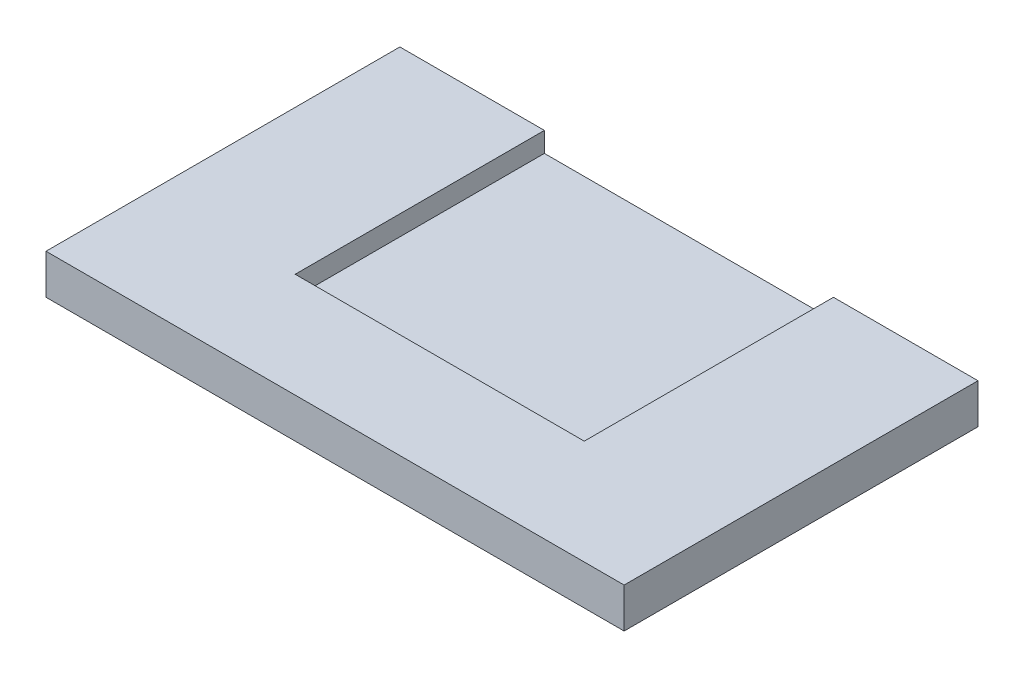
ISO-10303-21;
HEADER;
FILE_DESCRIPTION(('STEP AP214'),'2;1');
FILE_NAME('part.step','',(''),(''),'','','');
FILE_SCHEMA(('AUTOMOTIVE_DESIGN { 1 0 10303 214 1 1 1 1 }'));
ENDSEC;
DATA;
#1=APPLICATION_CONTEXT('core data for automotive mechanical design processes');
#2=APPLICATION_PROTOCOL_DEFINITION('international standard','automotive_design',2000,#1);
#3=PRODUCT_CONTEXT('',#1,'mechanical');
#4=PRODUCT('Part','Part','',(#3));
#5=PRODUCT_RELATED_PRODUCT_CATEGORY('part','',(#4));
#6=PRODUCT_DEFINITION_FORMATION('','',#4);
#7=PRODUCT_DEFINITION_CONTEXT('part definition',#1,'design');
#8=PRODUCT_DEFINITION('design','',#6,#7);
#9=PRODUCT_DEFINITION_SHAPE('','',#8);
#10=(LENGTH_UNIT() NAMED_UNIT(*) SI_UNIT(.MILLI.,.METRE.));
#11=(NAMED_UNIT(*) PLANE_ANGLE_UNIT() SI_UNIT($,.RADIAN.));
#12=(NAMED_UNIT(*) SI_UNIT($,.STERADIAN.) SOLID_ANGLE_UNIT());
#13=UNCERTAINTY_MEASURE_WITH_UNIT(LENGTH_MEASURE(1.E-05),#10,'distance_accuracy_value','');
#14=(GEOMETRIC_REPRESENTATION_CONTEXT(3) GLOBAL_UNCERTAINTY_ASSIGNED_CONTEXT((#13)) GLOBAL_UNIT_ASSIGNED_CONTEXT((#10,
#11,#12)) REPRESENTATION_CONTEXT('',''));
#15=CARTESIAN_POINT('',(0.,0.,0.));
#16=DIRECTION('',(0.,0.,1.));
#17=DIRECTION('',(1.,0.,0.));
#18=AXIS2_PLACEMENT_3D('',#15,#16,#17);
#19=CARTESIAN_POINT('',(-66.6066908635703,4.,36.3519764590724));
#20=DIRECTION('',(0.,0.,1.));
#21=DIRECTION('',(1.,0.,0.));
#22=AXIS2_PLACEMENT_3D('',#19,#20,#21);
#23=PLANE('',#22);
#24=DIRECTION('',(1.,0.,0.));
#25=VECTOR('',#24,1.);
#26=CARTESIAN_POINT('',(0.,2.,36.3519764590724));
#27=LINE('',#26,#25);
#28=CARTESIAN_POINT('',(-66.6066908635703,2.,36.3519764590724));
#29=VERTEX_POINT('',#28);
#30=CARTESIAN_POINT('',(-37.6066908635703,2.,36.3519764590724));
#31=VERTEX_POINT('',#30);
#32=EDGE_CURVE('E45',#29,#31,#27,.T.);
#33=ORIENTED_EDGE('',*,*,#32,.T.);
#34=DIRECTION('',(0.,1.,0.));
#35=VECTOR('',#34,1.);
#36=CARTESIAN_POINT('',(-37.6066908635703,2.,36.3519764590724));
#37=LINE('',#36,#35);
#38=CARTESIAN_POINT('',(-37.6066908635703,4.,36.3519764590724));
#39=VERTEX_POINT('',#38);
#40=EDGE_CURVE('E11',#31,#39,#37,.T.);
#41=ORIENTED_EDGE('',*,*,#40,.T.);
#42=DIRECTION('',(1.,0.,0.));
#43=VECTOR('',#42,1.);
#44=CARTESIAN_POINT('',(0.,4.,36.3519764590724));
#45=LINE('',#44,#43);
#46=CARTESIAN_POINT('',(-23.1066908635703,4.,36.3519764590724));
#47=VERTEX_POINT('',#46);
#48=EDGE_CURVE('E59',#39,#47,#45,.T.);
#49=ORIENTED_EDGE('',*,*,#48,.T.);
#50=DIRECTION('',(0.,-1.,0.));
#51=VECTOR('',#50,1.);
#52=CARTESIAN_POINT('',(-23.1066908635703,0.,36.3519764590724));
#53=LINE('',#52,#51);
#54=CARTESIAN_POINT('',(-23.1066908635703,0.,36.3519764590724));
#55=VERTEX_POINT('',#54);
#56=EDGE_CURVE('E40',#47,#55,#53,.T.);
#57=ORIENTED_EDGE('',*,*,#56,.T.);
#58=DIRECTION('',(1.,0.,0.));
#59=VECTOR('',#58,1.);
#60=CARTESIAN_POINT('',(0.,0.,36.3519764590724));
#61=LINE('',#60,#59);
#62=CARTESIAN_POINT('',(-81.1066908635703,0.,36.3519764590724));
#63=VERTEX_POINT('',#62);
#64=EDGE_CURVE('E137',#63,#55,#61,.T.);
#65=ORIENTED_EDGE('',*,*,#64,.F.);
#66=DIRECTION('',(0.,1.,0.));
#67=VECTOR('',#66,1.);
#68=CARTESIAN_POINT('',(-81.1066908635703,0.,36.3519764590724));
#69=LINE('',#68,#67);
#70=CARTESIAN_POINT('',(-81.1066908635703,4.,36.3519764590724));
#71=VERTEX_POINT('',#70);
#72=EDGE_CURVE('E135',#63,#71,#69,.T.);
#73=ORIENTED_EDGE('',*,*,#72,.T.);
#74=CARTESIAN_POINT('',(-66.6066908635703,4.,36.3519764590724));
#75=VERTEX_POINT('',#74);
#76=EDGE_CURVE('E120',#71,#75,#45,.T.);
#77=ORIENTED_EDGE('',*,*,#76,.T.);
#78=DIRECTION('',(0.,1.,0.));
#79=VECTOR('',#78,1.);
#80=CARTESIAN_POINT('',(-66.6066908635703,2.,36.3519764590724));
#81=LINE('',#80,#79);
#82=EDGE_CURVE('E141',#29,#75,#81,.T.);
#83=ORIENTED_EDGE('',*,*,#82,.F.);
#84=EDGE_LOOP('',(#33,#41,#49,#57,#65,#73,#77,#83));
#85=FACE_BOUND('',#84,.T.);
#86=ADVANCED_FACE('F37',(#85),#23,.F.);
#87=CARTESIAN_POINT('',(0.,4.,0.));
#88=DIRECTION('',(0.,1.,0.));
#89=DIRECTION('',(0.,0.,1.));
#90=AXIS2_PLACEMENT_3D('',#87,#88,#89);
#91=PLANE('',#90);
#92=ORIENTED_EDGE('',*,*,#76,.F.);
#93=DIRECTION('',(0.,0.,-1.));
#94=VECTOR('',#93,1.);
#95=CARTESIAN_POINT('',(-81.1066908635703,4.,71.8519764590724));
#96=LINE('',#95,#94);
#97=CARTESIAN_POINT('',(-81.1066908635703,4.,71.8519764590724));
#98=VERTEX_POINT('',#97);
#99=EDGE_CURVE('E107',#98,#71,#96,.T.);
#100=ORIENTED_EDGE('',*,*,#99,.F.);
#101=DIRECTION('',(1.,0.,0.));
#102=VECTOR('',#101,1.);
#103=CARTESIAN_POINT('',(-127.10669086357,4.,71.8519764590724));
#104=LINE('',#103,#102);
#105=CARTESIAN_POINT('',(-23.1066908635703,4.,71.8519764590724));
#106=VERTEX_POINT('',#105);
#107=EDGE_CURVE('E116',#98,#106,#104,.T.);
#108=ORIENTED_EDGE('',*,*,#107,.T.);
#109=DIRECTION('',(0.,0.,1.));
#110=VECTOR('',#109,1.);
#111=CARTESIAN_POINT('',(-23.1066908635703,4.,-78.1480235409276));
#112=LINE('',#111,#110);
#113=EDGE_CURVE('E128',#47,#106,#112,.T.);
#114=ORIENTED_EDGE('',*,*,#113,.F.);
#115=ORIENTED_EDGE('',*,*,#48,.F.);
#116=DIRECTION('',(0.,0.,-1.));
#117=VECTOR('',#116,1.);
#118=CARTESIAN_POINT('',(-37.6066908635703,4.,0.));
#119=LINE('',#118,#117);
#120=CARTESIAN_POINT('',(-37.6066908635703,4.,61.3519764590724));
#121=VERTEX_POINT('',#120);
#122=EDGE_CURVE('E148',#121,#39,#119,.T.);
#123=ORIENTED_EDGE('',*,*,#122,.F.);
#124=DIRECTION('',(1.,0.,0.));
#125=VECTOR('',#124,1.);
#126=CARTESIAN_POINT('',(0.,4.,61.3519764590724));
#127=LINE('',#126,#125);
#128=CARTESIAN_POINT('',(-66.6066908635703,4.,61.3519764590724));
#129=VERTEX_POINT('',#128);
#130=EDGE_CURVE('E138',#129,#121,#127,.T.);
#131=ORIENTED_EDGE('',*,*,#130,.F.);
#132=DIRECTION('',(0.,0.,-1.));
#133=VECTOR('',#132,1.);
#134=CARTESIAN_POINT('',(-66.6066908635703,4.,0.));
#135=LINE('',#134,#133);
#136=EDGE_CURVE('E146',#129,#75,#135,.T.);
#137=ORIENTED_EDGE('',*,*,#136,.T.);
#138=EDGE_LOOP('',(#92,#100,#108,#114,#115,#123,#131,#137));
#139=FACE_BOUND('',#138,.T.);
#140=ADVANCED_FACE('F115',(#139),#91,.T.);
#141=CARTESIAN_POINT('',(-127.10669086357,4.,71.8519764590724));
#142=DIRECTION('',(0.,0.,-1.));
#143=DIRECTION('',(-1.,0.,0.));
#144=AXIS2_PLACEMENT_3D('',#141,#142,#143);
#145=PLANE('',#144);
#146=DIRECTION('',(0.,1.,0.));
#147=VECTOR('',#146,1.);
#148=CARTESIAN_POINT('',(-81.1066908635703,0.,71.8519764590724));
#149=LINE('',#148,#147);
#150=CARTESIAN_POINT('',(-81.1066908635703,0.,71.8519764590724));
#151=VERTEX_POINT('',#150);
#152=EDGE_CURVE('E104',#151,#98,#149,.T.);
#153=ORIENTED_EDGE('',*,*,#152,.F.);
#154=DIRECTION('',(1.,0.,0.));
#155=VECTOR('',#154,1.);
#156=CARTESIAN_POINT('',(-127.10669086357,0.,71.8519764590724));
#157=LINE('',#156,#155);
#158=CARTESIAN_POINT('',(-23.1066908635703,0.,71.8519764590724));
#159=VERTEX_POINT('',#158);
#160=EDGE_CURVE('E126',#151,#159,#157,.T.);
#161=ORIENTED_EDGE('',*,*,#160,.T.);
#162=DIRECTION('',(0.,-1.,0.));
#163=VECTOR('',#162,1.);
#164=CARTESIAN_POINT('',(-23.1066908635703,4.,71.8519764590724));
#165=LINE('',#164,#163);
#166=EDGE_CURVE('E125',#106,#159,#165,.T.);
#167=ORIENTED_EDGE('',*,*,#166,.F.);
#168=ORIENTED_EDGE('',*,*,#107,.F.);
#169=EDGE_LOOP('',(#153,#161,#167,#168));
#170=FACE_BOUND('',#169,.T.);
#171=ADVANCED_FACE('F123',(#170),#145,.F.);
#172=CARTESIAN_POINT('',(0.,0.,0.));
#173=DIRECTION('',(0.,1.,0.));
#174=DIRECTION('',(0.,0.,1.));
#175=AXIS2_PLACEMENT_3D('',#172,#173,#174);
#176=PLANE('',#175);
#177=DIRECTION('',(0.,0.,1.));
#178=VECTOR('',#177,1.);
#179=CARTESIAN_POINT('',(-81.1066908635703,0.,-78.1480235409276));
#180=LINE('',#179,#178);
#181=EDGE_CURVE('E109',#63,#151,#180,.T.);
#182=ORIENTED_EDGE('',*,*,#181,.F.);
#183=ORIENTED_EDGE('',*,*,#64,.T.);
#184=DIRECTION('',(0.,0.,-1.));
#185=VECTOR('',#184,1.);
#186=CARTESIAN_POINT('',(-23.1066908635703,0.,71.8519764590724));
#187=LINE('',#186,#185);
#188=EDGE_CURVE('E173',#159,#55,#187,.T.);
#189=ORIENTED_EDGE('',*,*,#188,.F.);
#190=ORIENTED_EDGE('',*,*,#160,.F.);
#191=EDGE_LOOP('',(#182,#183,#189,#190));
#192=FACE_BOUND('',#191,.T.);
#193=ADVANCED_FACE('F180',(#192),#176,.F.);
#194=CARTESIAN_POINT('',(-81.1066908635703,0.,0.));
#195=DIRECTION('',(-1.,0.,0.));
#196=DIRECTION('',(0.,0.,1.));
#197=AXIS2_PLACEMENT_3D('',#194,#195,#196);
#198=PLANE('',#197);
#199=ORIENTED_EDGE('',*,*,#72,.F.);
#200=ORIENTED_EDGE('',*,*,#181,.T.);
#201=ORIENTED_EDGE('',*,*,#152,.T.);
#202=ORIENTED_EDGE('',*,*,#99,.T.);
#203=EDGE_LOOP('',(#199,#200,#201,#202));
#204=FACE_BOUND('',#203,.T.);
#205=ADVANCED_FACE('F106',(#204),#198,.T.);
#206=CARTESIAN_POINT('',(-66.6066908635703,2.,0.));
#207=DIRECTION('',(1.,0.,0.));
#208=DIRECTION('',(0.,0.,-1.));
#209=AXIS2_PLACEMENT_3D('',#206,#207,#208);
#210=PLANE('',#209);
#211=ORIENTED_EDGE('',*,*,#136,.F.);
#212=DIRECTION('',(0.,1.,0.));
#213=VECTOR('',#212,1.);
#214=CARTESIAN_POINT('',(-66.6066908635703,2.,61.3519764590724));
#215=LINE('',#214,#213);
#216=CARTESIAN_POINT('',(-66.6066908635703,2.,61.3519764590724));
#217=VERTEX_POINT('',#216);
#218=EDGE_CURVE('E154',#217,#129,#215,.T.);
#219=ORIENTED_EDGE('',*,*,#218,.F.);
#220=DIRECTION('',(0.,0.,-1.));
#221=VECTOR('',#220,1.);
#222=CARTESIAN_POINT('',(-66.6066908635703,2.,0.));
#223=LINE('',#222,#221);
#224=EDGE_CURVE('E158',#217,#29,#223,.T.);
#225=ORIENTED_EDGE('',*,*,#224,.T.);
#226=ORIENTED_EDGE('',*,*,#82,.T.);
#227=EDGE_LOOP('',(#211,#219,#225,#226));
#228=FACE_BOUND('',#227,.T.);
#229=ADVANCED_FACE('F187',(#228),#210,.T.);
#230=CARTESIAN_POINT('',(-37.6066908635703,2.,0.));
#231=DIRECTION('',(1.,0.,0.));
#232=DIRECTION('',(0.,0.,-1.));
#233=AXIS2_PLACEMENT_3D('',#230,#231,#232);
#234=PLANE('',#233);
#235=ORIENTED_EDGE('',*,*,#122,.T.);
#236=ORIENTED_EDGE('',*,*,#40,.F.);
#237=DIRECTION('',(0.,0.,-1.));
#238=VECTOR('',#237,1.);
#239=CARTESIAN_POINT('',(-37.6066908635703,2.,0.));
#240=LINE('',#239,#238);
#241=CARTESIAN_POINT('',(-37.6066908635703,2.,61.3519764590724));
#242=VERTEX_POINT('',#241);
#243=EDGE_CURVE('E152',#242,#31,#240,.T.);
#244=ORIENTED_EDGE('',*,*,#243,.F.);
#245=DIRECTION('',(0.,1.,0.));
#246=VECTOR('',#245,1.);
#247=CARTESIAN_POINT('',(-37.6066908635703,2.,61.3519764590724));
#248=LINE('',#247,#246);
#249=EDGE_CURVE('E161',#242,#121,#248,.T.);
#250=ORIENTED_EDGE('',*,*,#249,.T.);
#251=EDGE_LOOP('',(#235,#236,#244,#250));
#252=FACE_BOUND('',#251,.T.);
#253=ADVANCED_FACE('F168',(#252),#234,.F.);
#254=CARTESIAN_POINT('',(0.,2.,61.3519764590724));
#255=DIRECTION('',(0.,0.,1.));
#256=DIRECTION('',(1.,0.,0.));
#257=AXIS2_PLACEMENT_3D('',#254,#255,#256);
#258=PLANE('',#257);
#259=ORIENTED_EDGE('',*,*,#130,.T.);
#260=ORIENTED_EDGE('',*,*,#249,.F.);
#261=DIRECTION('',(1.,0.,0.));
#262=VECTOR('',#261,1.);
#263=CARTESIAN_POINT('',(0.,2.,61.3519764590724));
#264=LINE('',#263,#262);
#265=EDGE_CURVE('E132',#217,#242,#264,.T.);
#266=ORIENTED_EDGE('',*,*,#265,.F.);
#267=ORIENTED_EDGE('',*,*,#218,.T.);
#268=EDGE_LOOP('',(#259,#260,#266,#267));
#269=FACE_BOUND('',#268,.T.);
#270=ADVANCED_FACE('F200',(#269),#258,.F.);
#271=CARTESIAN_POINT('',(0.,2.,0.));
#272=DIRECTION('',(0.,1.,0.));
#273=DIRECTION('',(0.,0.,1.));
#274=AXIS2_PLACEMENT_3D('',#271,#272,#273);
#275=PLANE('',#274);
#276=ORIENTED_EDGE('',*,*,#265,.T.);
#277=ORIENTED_EDGE('',*,*,#243,.T.);
#278=ORIENTED_EDGE('',*,*,#32,.F.);
#279=ORIENTED_EDGE('',*,*,#224,.F.);
#280=EDGE_LOOP('',(#276,#277,#278,#279));
#281=FACE_BOUND('',#280,.T.);
#282=ADVANCED_FACE('F164',(#281),#275,.T.);
#283=CARTESIAN_POINT('',(-23.1066908635703,0.,0.));
#284=DIRECTION('',(1.,0.,0.));
#285=DIRECTION('',(0.,0.,-1.));
#286=AXIS2_PLACEMENT_3D('',#283,#284,#285);
#287=PLANE('',#286);
#288=ORIENTED_EDGE('',*,*,#56,.F.);
#289=ORIENTED_EDGE('',*,*,#113,.T.);
#290=ORIENTED_EDGE('',*,*,#166,.T.);
#291=ORIENTED_EDGE('',*,*,#188,.T.);
#292=EDGE_LOOP('',(#288,#289,#290,#291));
#293=FACE_BOUND('',#292,.T.);
#294=ADVANCED_FACE('F177',(#293),#287,.T.);
#295=CLOSED_SHELL('',(#86,#140,#171,#193,#205,#229,#253,#270,#282,#294));
#296=MANIFOLD_SOLID_BREP('B2',#295);
#297=ADVANCED_BREP_SHAPE_REPRESENTATION('',(#18,#296),#14);
#298=SHAPE_DEFINITION_REPRESENTATION(#9,#297);
ENDSEC;
END-ISO-10303-21;
